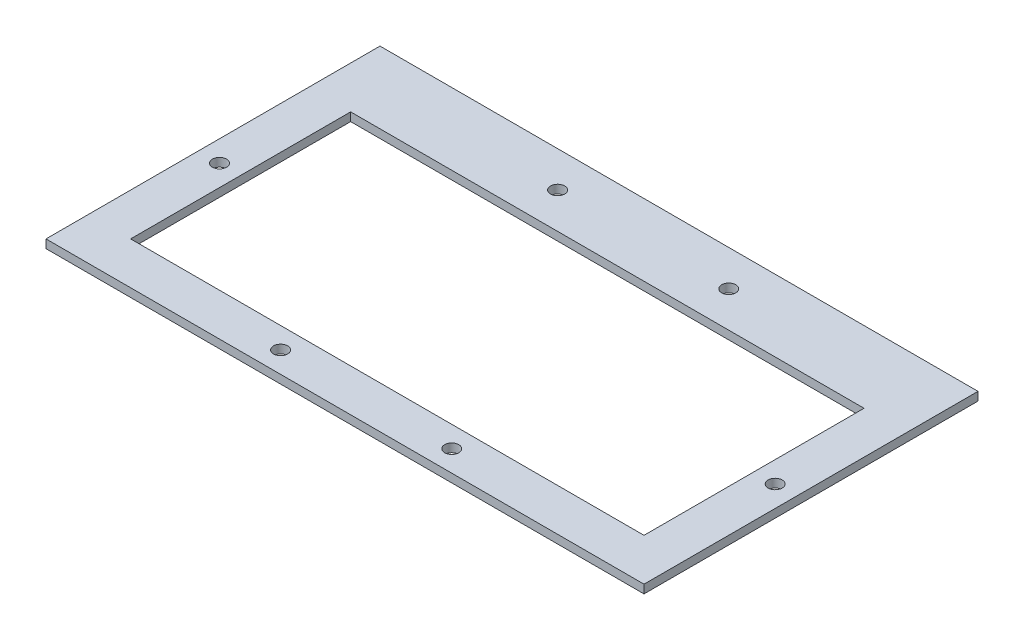
ISO-10303-21;
HEADER;
FILE_DESCRIPTION(('STEP AP214'),'2;1');
FILE_NAME('part.step','',(''),(''),'','','');
FILE_SCHEMA(('AUTOMOTIVE_DESIGN { 1 0 10303 214 1 1 1 1 }'));
ENDSEC;
DATA;
#1=APPLICATION_CONTEXT('core data for automotive mechanical design processes');
#2=APPLICATION_PROTOCOL_DEFINITION('international standard','automotive_design',2000,#1);
#3=PRODUCT_CONTEXT('',#1,'mechanical');
#4=PRODUCT('Part','Part','',(#3));
#5=PRODUCT_RELATED_PRODUCT_CATEGORY('part','',(#4));
#6=PRODUCT_DEFINITION_FORMATION('','',#4);
#7=PRODUCT_DEFINITION_CONTEXT('part definition',#1,'design');
#8=PRODUCT_DEFINITION('design','',#6,#7);
#9=PRODUCT_DEFINITION_SHAPE('','',#8);
#10=(LENGTH_UNIT() NAMED_UNIT(*) SI_UNIT(.MILLI.,.METRE.));
#11=(NAMED_UNIT(*) PLANE_ANGLE_UNIT() SI_UNIT($,.RADIAN.));
#12=(NAMED_UNIT(*) SI_UNIT($,.STERADIAN.) SOLID_ANGLE_UNIT());
#13=UNCERTAINTY_MEASURE_WITH_UNIT(LENGTH_MEASURE(1.E-05),#10,'distance_accuracy_value','');
#14=(GEOMETRIC_REPRESENTATION_CONTEXT(3) GLOBAL_UNCERTAINTY_ASSIGNED_CONTEXT((#13)) GLOBAL_UNIT_ASSIGNED_CONTEXT((#10,
#11,#12)) REPRESENTATION_CONTEXT('',''));
#15=CARTESIAN_POINT('',(0.,0.,0.));
#16=DIRECTION('',(0.,0.,1.));
#17=DIRECTION('',(1.,0.,0.));
#18=AXIS2_PLACEMENT_3D('',#15,#16,#17);
#19=CARTESIAN_POINT('',(0.,3.,0.));
#20=DIRECTION('',(-1.,0.,0.));
#21=DIRECTION('',(0.,0.,1.));
#22=AXIS2_PLACEMENT_3D('',#19,#20,#21);
#23=PLANE('',#22);
#24=DIRECTION('',(0.,0.,-1.));
#25=VECTOR('',#24,1.);
#26=CARTESIAN_POINT('',(0.,0.,0.));
#27=LINE('',#26,#25);
#28=CARTESIAN_POINT('',(0.,0.,93.));
#29=VERTEX_POINT('',#28);
#30=CARTESIAN_POINT('',(0.,0.,-25.4));
#31=VERTEX_POINT('',#30);
#32=EDGE_CURVE('E164',#29,#31,#27,.T.);
#33=ORIENTED_EDGE('',*,*,#32,.F.);
#34=DIRECTION('',(0.,-1.,0.));
#35=VECTOR('',#34,1.);
#36=CARTESIAN_POINT('',(0.,3.,93.));
#37=LINE('',#36,#35);
#38=CARTESIAN_POINT('',(0.,3.,93.));
#39=VERTEX_POINT('',#38);
#40=EDGE_CURVE('E11',#39,#29,#37,.T.);
#41=ORIENTED_EDGE('',*,*,#40,.F.);
#42=DIRECTION('',(0.,0.,-1.));
#43=VECTOR('',#42,1.);
#44=CARTESIAN_POINT('',(0.,3.,0.));
#45=LINE('',#44,#43);
#46=CARTESIAN_POINT('',(0.,3.,-25.4));
#47=VERTEX_POINT('',#46);
#48=EDGE_CURVE('E126',#39,#47,#45,.T.);
#49=ORIENTED_EDGE('',*,*,#48,.T.);
#50=DIRECTION('',(0.,-1.,0.));
#51=VECTOR('',#50,1.);
#52=CARTESIAN_POINT('',(0.,3.,-25.4));
#53=LINE('',#52,#51);
#54=EDGE_CURVE('E54',#47,#31,#53,.T.);
#55=ORIENTED_EDGE('',*,*,#54,.T.);
#56=EDGE_LOOP('',(#33,#41,#49,#55));
#57=FACE_BOUND('',#56,.T.);
#58=ADVANCED_FACE('F35',(#57),#23,.T.);
#59=CARTESIAN_POINT('',(0.,3.,93.));
#60=DIRECTION('',(0.,0.,1.));
#61=DIRECTION('',(1.,0.,0.));
#62=AXIS2_PLACEMENT_3D('',#59,#60,#61);
#63=PLANE('',#62);
#64=DIRECTION('',(-1.,0.,0.));
#65=VECTOR('',#64,1.);
#66=CARTESIAN_POINT('',(0.,0.,93.));
#67=LINE('',#66,#65);
#68=CARTESIAN_POINT('',(212.,0.,93.));
#69=VERTEX_POINT('',#68);
#70=EDGE_CURVE('E113',#69,#29,#67,.T.);
#71=ORIENTED_EDGE('',*,*,#70,.F.);
#72=DIRECTION('',(0.,-1.,0.));
#73=VECTOR('',#72,1.);
#74=CARTESIAN_POINT('',(212.,3.,93.));
#75=LINE('',#74,#73);
#76=CARTESIAN_POINT('',(212.,3.,93.));
#77=VERTEX_POINT('',#76);
#78=EDGE_CURVE('E45',#77,#69,#75,.T.);
#79=ORIENTED_EDGE('',*,*,#78,.F.);
#80=DIRECTION('',(-1.,0.,0.));
#81=VECTOR('',#80,1.);
#82=CARTESIAN_POINT('',(0.,3.,93.));
#83=LINE('',#82,#81);
#84=EDGE_CURVE('E111',#77,#39,#83,.T.);
#85=ORIENTED_EDGE('',*,*,#84,.T.);
#86=ORIENTED_EDGE('',*,*,#40,.T.);
#87=EDGE_LOOP('',(#71,#79,#85,#86));
#88=FACE_BOUND('',#87,.T.);
#89=ADVANCED_FACE('F109',(#88),#63,.T.);
#90=CARTESIAN_POINT('',(212.,3.,0.));
#91=DIRECTION('',(-1.,0.,0.));
#92=DIRECTION('',(0.,0.,1.));
#93=AXIS2_PLACEMENT_3D('',#90,#91,#92);
#94=PLANE('',#93);
#95=DIRECTION('',(0.,0.,-1.));
#96=VECTOR('',#95,1.);
#97=CARTESIAN_POINT('',(212.,0.,0.));
#98=LINE('',#97,#96);
#99=CARTESIAN_POINT('',(212.,0.,-25.4));
#100=VERTEX_POINT('',#99);
#101=EDGE_CURVE('E167',#69,#100,#98,.T.);
#102=ORIENTED_EDGE('',*,*,#101,.T.);
#103=DIRECTION('',(0.,-1.,0.));
#104=VECTOR('',#103,1.);
#105=CARTESIAN_POINT('',(212.,3.,-25.4));
#106=LINE('',#105,#104);
#107=CARTESIAN_POINT('',(212.,3.,-25.4));
#108=VERTEX_POINT('',#107);
#109=EDGE_CURVE('E80',#108,#100,#106,.T.);
#110=ORIENTED_EDGE('',*,*,#109,.F.);
#111=DIRECTION('',(0.,0.,-1.));
#112=VECTOR('',#111,1.);
#113=CARTESIAN_POINT('',(212.,3.,0.));
#114=LINE('',#113,#112);
#115=EDGE_CURVE('E117',#77,#108,#114,.T.);
#116=ORIENTED_EDGE('',*,*,#115,.F.);
#117=ORIENTED_EDGE('',*,*,#78,.T.);
#118=EDGE_LOOP('',(#102,#110,#116,#117));
#119=FACE_BOUND('',#118,.T.);
#120=ADVANCED_FACE('F118',(#119),#94,.F.);
#121=CARTESIAN_POINT('',(15.,3.,0.));
#122=DIRECTION('',(1.,0.,0.));
#123=DIRECTION('',(0.,0.,-1.));
#124=AXIS2_PLACEMENT_3D('',#121,#122,#123);
#125=PLANE('',#124);
#126=DIRECTION('',(0.,0.,1.));
#127=VECTOR('',#126,1.);
#128=CARTESIAN_POINT('',(15.,0.,0.));
#129=LINE('',#128,#127);
#130=CARTESIAN_POINT('',(15.,0.,0.));
#131=VERTEX_POINT('',#130);
#132=CARTESIAN_POINT('',(15.,0.,78.));
#133=VERTEX_POINT('',#132);
#134=EDGE_CURVE('E149',#131,#133,#129,.T.);
#135=ORIENTED_EDGE('',*,*,#134,.F.);
#136=DIRECTION('',(0.,-1.,0.));
#137=VECTOR('',#136,1.);
#138=CARTESIAN_POINT('',(15.,3.,0.));
#139=LINE('',#138,#137);
#140=CARTESIAN_POINT('',(15.,3.,0.));
#141=VERTEX_POINT('',#140);
#142=EDGE_CURVE('E39',#141,#131,#139,.T.);
#143=ORIENTED_EDGE('',*,*,#142,.F.);
#144=DIRECTION('',(0.,0.,1.));
#145=VECTOR('',#144,1.);
#146=CARTESIAN_POINT('',(15.,3.,0.));
#147=LINE('',#146,#145);
#148=CARTESIAN_POINT('',(15.,3.,78.));
#149=VERTEX_POINT('',#148);
#150=EDGE_CURVE('E187',#141,#149,#147,.T.);
#151=ORIENTED_EDGE('',*,*,#150,.T.);
#152=DIRECTION('',(0.,-1.,0.));
#153=VECTOR('',#152,1.);
#154=CARTESIAN_POINT('',(15.,3.,78.));
#155=LINE('',#154,#153);
#156=EDGE_CURVE('E148',#149,#133,#155,.T.);
#157=ORIENTED_EDGE('',*,*,#156,.T.);
#158=EDGE_LOOP('',(#135,#143,#151,#157));
#159=FACE_BOUND('',#158,.T.);
#160=ADVANCED_FACE('F37',(#159),#125,.T.);
#161=CARTESIAN_POINT('',(0.,3.,0.));
#162=DIRECTION('',(0.,0.,-1.));
#163=DIRECTION('',(-1.,0.,0.));
#164=AXIS2_PLACEMENT_3D('',#161,#162,#163);
#165=PLANE('',#164);
#166=DIRECTION('',(1.,0.,0.));
#167=VECTOR('',#166,1.);
#168=CARTESIAN_POINT('',(0.,0.,0.));
#169=LINE('',#168,#167);
#170=CARTESIAN_POINT('',(197.,0.,0.));
#171=VERTEX_POINT('',#170);
#172=EDGE_CURVE('E152',#131,#171,#169,.T.);
#173=ORIENTED_EDGE('',*,*,#172,.T.);
#174=DIRECTION('',(0.,-1.,0.));
#175=VECTOR('',#174,1.);
#176=CARTESIAN_POINT('',(197.,3.,0.));
#177=LINE('',#176,#175);
#178=CARTESIAN_POINT('',(197.,3.,0.));
#179=VERTEX_POINT('',#178);
#180=EDGE_CURVE('E192',#179,#171,#177,.T.);
#181=ORIENTED_EDGE('',*,*,#180,.F.);
#182=DIRECTION('',(1.,0.,0.));
#183=VECTOR('',#182,1.);
#184=CARTESIAN_POINT('',(0.,3.,0.));
#185=LINE('',#184,#183);
#186=EDGE_CURVE('E200',#141,#179,#185,.T.);
#187=ORIENTED_EDGE('',*,*,#186,.F.);
#188=ORIENTED_EDGE('',*,*,#142,.T.);
#189=EDGE_LOOP('',(#173,#181,#187,#188));
#190=FACE_BOUND('',#189,.T.);
#191=ADVANCED_FACE('F199',(#190),#165,.F.);
#192=CARTESIAN_POINT('',(197.,3.,0.));
#193=DIRECTION('',(-1.,0.,0.));
#194=DIRECTION('',(0.,0.,1.));
#195=AXIS2_PLACEMENT_3D('',#192,#193,#194);
#196=PLANE('',#195);
#197=DIRECTION('',(0.,0.,-1.));
#198=VECTOR('',#197,1.);
#199=CARTESIAN_POINT('',(197.,0.,0.));
#200=LINE('',#199,#198);
#201=CARTESIAN_POINT('',(197.,0.,78.));
#202=VERTEX_POINT('',#201);
#203=EDGE_CURVE('E155',#202,#171,#200,.T.);
#204=ORIENTED_EDGE('',*,*,#203,.F.);
#205=DIRECTION('',(0.,-1.,0.));
#206=VECTOR('',#205,1.);
#207=CARTESIAN_POINT('',(197.,3.,78.));
#208=LINE('',#207,#206);
#209=CARTESIAN_POINT('',(197.,3.,78.));
#210=VERTEX_POINT('',#209);
#211=EDGE_CURVE('E191',#210,#202,#208,.T.);
#212=ORIENTED_EDGE('',*,*,#211,.F.);
#213=DIRECTION('',(0.,0.,-1.));
#214=VECTOR('',#213,1.);
#215=CARTESIAN_POINT('',(197.,3.,0.));
#216=LINE('',#215,#214);
#217=EDGE_CURVE('E405',#210,#179,#216,.T.);
#218=ORIENTED_EDGE('',*,*,#217,.T.);
#219=ORIENTED_EDGE('',*,*,#180,.T.);
#220=EDGE_LOOP('',(#204,#212,#218,#219));
#221=FACE_BOUND('',#220,.T.);
#222=ADVANCED_FACE('F212',(#221),#196,.T.);
#223=CARTESIAN_POINT('',(204.5,3.,39.));
#224=DIRECTION('',(0.,-1.,0.));
#225=DIRECTION('',(0.,0.,-1.));
#226=AXIS2_PLACEMENT_3D('',#223,#224,#225);
#227=CYLINDRICAL_SURFACE('',#226,2.5);
#228=CARTESIAN_POINT('',(204.5,3.,39.));
#229=DIRECTION('',(0.,1.,0.));
#230=DIRECTION('',(0.,0.,1.));
#231=AXIS2_PLACEMENT_3D('',#228,#229,#230);
#232=CIRCLE('',#231,2.5);
#233=CARTESIAN_POINT('',(204.5,3.,41.5));
#234=VERTEX_POINT('',#233);
#235=EDGE_CURVE('E142',#234,#234,#232,.T.);
#236=ORIENTED_EDGE('',*,*,#235,.T.);
#237=EDGE_LOOP('',(#236));
#238=FACE_BOUND('',#237,.T.);
#239=CARTESIAN_POINT('',(204.5,0.,39.));
#240=DIRECTION('',(0.,1.,0.));
#241=DIRECTION('',(0.,0.,1.));
#242=AXIS2_PLACEMENT_3D('',#239,#240,#241);
#243=CIRCLE('',#242,2.5);
#244=CARTESIAN_POINT('',(204.5,0.,41.5));
#245=VERTEX_POINT('',#244);
#246=EDGE_CURVE('E181',#245,#245,#243,.T.);
#247=ORIENTED_EDGE('',*,*,#246,.F.);
#248=EDGE_LOOP('',(#247));
#249=FACE_BOUND('',#248,.T.);
#250=ADVANCED_FACE('F214',(#238,#249),#227,.F.);
#251=CARTESIAN_POINT('',(75.6666666666667,3.,85.5));
#252=DIRECTION('',(0.,-1.,0.));
#253=DIRECTION('',(0.,0.,-1.));
#254=AXIS2_PLACEMENT_3D('',#251,#252,#253);
#255=CYLINDRICAL_SURFACE('',#254,2.50000000000001);
#256=CARTESIAN_POINT('',(75.6666666666667,3.,85.5));
#257=DIRECTION('',(0.,1.,0.));
#258=DIRECTION('',(0.,0.,1.));
#259=AXIS2_PLACEMENT_3D('',#256,#257,#258);
#260=CIRCLE('',#259,2.50000000000001);
#261=CARTESIAN_POINT('',(75.6666666666667,3.,88.));
#262=VERTEX_POINT('',#261);
#263=EDGE_CURVE('E139',#262,#262,#260,.T.);
#264=ORIENTED_EDGE('',*,*,#263,.T.);
#265=EDGE_LOOP('',(#264));
#266=FACE_BOUND('',#265,.T.);
#267=CARTESIAN_POINT('',(75.6666666666667,0.,85.5));
#268=DIRECTION('',(0.,1.,0.));
#269=DIRECTION('',(0.,0.,1.));
#270=AXIS2_PLACEMENT_3D('',#267,#268,#269);
#271=CIRCLE('',#270,2.50000000000001);
#272=CARTESIAN_POINT('',(75.6666666666667,0.,88.));
#273=VERTEX_POINT('',#272);
#274=EDGE_CURVE('E178',#273,#273,#271,.T.);
#275=ORIENTED_EDGE('',*,*,#274,.F.);
#276=EDGE_LOOP('',(#275));
#277=FACE_BOUND('',#276,.T.);
#278=ADVANCED_FACE('F220',(#266,#277),#255,.F.);
#279=CARTESIAN_POINT('',(136.333333333333,3.,85.5));
#280=DIRECTION('',(0.,-1.,0.));
#281=DIRECTION('',(0.,0.,-1.));
#282=AXIS2_PLACEMENT_3D('',#279,#280,#281);
#283=CYLINDRICAL_SURFACE('',#282,2.5);
#284=CARTESIAN_POINT('',(136.333333333333,3.,85.5));
#285=DIRECTION('',(0.,1.,0.));
#286=DIRECTION('',(0.,0.,1.));
#287=AXIS2_PLACEMENT_3D('',#284,#285,#286);
#288=CIRCLE('',#287,2.5);
#289=CARTESIAN_POINT('',(136.333333333333,3.,88.));
#290=VERTEX_POINT('',#289);
#291=EDGE_CURVE('E136',#290,#290,#288,.T.);
#292=ORIENTED_EDGE('',*,*,#291,.T.);
#293=EDGE_LOOP('',(#292));
#294=FACE_BOUND('',#293,.T.);
#295=CARTESIAN_POINT('',(136.333333333333,0.,85.5));
#296=DIRECTION('',(0.,1.,0.));
#297=DIRECTION('',(0.,0.,1.));
#298=AXIS2_PLACEMENT_3D('',#295,#296,#297);
#299=CIRCLE('',#298,2.5);
#300=CARTESIAN_POINT('',(136.333333333333,0.,88.));
#301=VERTEX_POINT('',#300);
#302=EDGE_CURVE('E175',#301,#301,#299,.T.);
#303=ORIENTED_EDGE('',*,*,#302,.F.);
#304=EDGE_LOOP('',(#303));
#305=FACE_BOUND('',#304,.T.);
#306=ADVANCED_FACE('F253',(#294,#305),#283,.F.);
#307=CARTESIAN_POINT('',(75.6666666666667,3.,-12.7));
#308=DIRECTION('',(0.,-1.,0.));
#309=DIRECTION('',(0.,0.,-1.));
#310=AXIS2_PLACEMENT_3D('',#307,#308,#309);
#311=CYLINDRICAL_SURFACE('',#310,2.50000000000001);
#312=CARTESIAN_POINT('',(75.6666666666667,3.,-12.7));
#313=DIRECTION('',(0.,1.,0.));
#314=DIRECTION('',(0.,0.,1.));
#315=AXIS2_PLACEMENT_3D('',#312,#313,#314);
#316=CIRCLE('',#315,2.50000000000001);
#317=CARTESIAN_POINT('',(75.6666666666667,3.,-10.2));
#318=VERTEX_POINT('',#317);
#319=EDGE_CURVE('E133',#318,#318,#316,.F.);
#320=ORIENTED_EDGE('',*,*,#319,.F.);
#321=EDGE_LOOP('',(#320));
#322=FACE_BOUND('',#321,.T.);
#323=CARTESIAN_POINT('',(75.6666666666667,0.,-12.7));
#324=DIRECTION('',(0.,1.,0.));
#325=DIRECTION('',(0.,0.,1.));
#326=AXIS2_PLACEMENT_3D('',#323,#324,#325);
#327=CIRCLE('',#326,2.50000000000001);
#328=CARTESIAN_POINT('',(75.6666666666667,0.,-10.2));
#329=VERTEX_POINT('',#328);
#330=EDGE_CURVE('E172',#329,#329,#327,.F.);
#331=ORIENTED_EDGE('',*,*,#330,.T.);
#332=EDGE_LOOP('',(#331));
#333=FACE_BOUND('',#332,.T.);
#334=ADVANCED_FACE('F257',(#322,#333),#311,.F.);
#335=CARTESIAN_POINT('',(0.,3.,-25.4));
#336=DIRECTION('',(0.,0.,-1.));
#337=DIRECTION('',(-1.,0.,0.));
#338=AXIS2_PLACEMENT_3D('',#335,#336,#337);
#339=PLANE('',#338);
#340=DIRECTION('',(1.,0.,0.));
#341=VECTOR('',#340,1.);
#342=CARTESIAN_POINT('',(0.,0.,-25.4));
#343=LINE('',#342,#341);
#344=EDGE_CURVE('E169',#31,#100,#343,.T.);
#345=ORIENTED_EDGE('',*,*,#344,.F.);
#346=ORIENTED_EDGE('',*,*,#54,.F.);
#347=DIRECTION('',(1.,0.,0.));
#348=VECTOR('',#347,1.);
#349=CARTESIAN_POINT('',(0.,3.,-25.4));
#350=LINE('',#349,#348);
#351=EDGE_CURVE('E121',#47,#108,#350,.T.);
#352=ORIENTED_EDGE('',*,*,#351,.T.);
#353=ORIENTED_EDGE('',*,*,#109,.T.);
#354=EDGE_LOOP('',(#345,#346,#352,#353));
#355=FACE_BOUND('',#354,.T.);
#356=ADVANCED_FACE('F234',(#355),#339,.T.);
#357=CARTESIAN_POINT('',(136.333333333333,3.,-12.7));
#358=DIRECTION('',(0.,-1.,0.));
#359=DIRECTION('',(0.,0.,-1.));
#360=AXIS2_PLACEMENT_3D('',#357,#358,#359);
#361=CYLINDRICAL_SURFACE('',#360,2.5);
#362=CARTESIAN_POINT('',(136.333333333333,3.,-12.7));
#363=DIRECTION('',(0.,1.,0.));
#364=DIRECTION('',(0.,0.,1.));
#365=AXIS2_PLACEMENT_3D('',#362,#363,#364);
#366=CIRCLE('',#365,2.5);
#367=CARTESIAN_POINT('',(136.333333333333,3.,-10.2));
#368=VERTEX_POINT('',#367);
#369=EDGE_CURVE('E128',#368,#368,#366,.F.);
#370=ORIENTED_EDGE('',*,*,#369,.F.);
#371=EDGE_LOOP('',(#370));
#372=FACE_BOUND('',#371,.T.);
#373=CARTESIAN_POINT('',(136.333333333333,0.,-12.7));
#374=DIRECTION('',(0.,1.,0.));
#375=DIRECTION('',(0.,0.,1.));
#376=AXIS2_PLACEMENT_3D('',#373,#374,#375);
#377=CIRCLE('',#376,2.5);
#378=CARTESIAN_POINT('',(136.333333333333,0.,-10.2));
#379=VERTEX_POINT('',#378);
#380=EDGE_CURVE('E161',#379,#379,#377,.F.);
#381=ORIENTED_EDGE('',*,*,#380,.T.);
#382=EDGE_LOOP('',(#381));
#383=FACE_BOUND('',#382,.T.);
#384=ADVANCED_FACE('F232',(#372,#383),#361,.F.);
#385=CARTESIAN_POINT('',(0.,3.,78.));
#386=DIRECTION('',(0.,0.,-1.));
#387=DIRECTION('',(-1.,0.,0.));
#388=AXIS2_PLACEMENT_3D('',#385,#386,#387);
#389=PLANE('',#388);
#390=DIRECTION('',(1.,0.,0.));
#391=VECTOR('',#390,1.);
#392=CARTESIAN_POINT('',(0.,0.,78.));
#393=LINE('',#392,#391);
#394=EDGE_CURVE('E158',#133,#202,#393,.T.);
#395=ORIENTED_EDGE('',*,*,#394,.F.);
#396=ORIENTED_EDGE('',*,*,#156,.F.);
#397=DIRECTION('',(1.,0.,0.));
#398=VECTOR('',#397,1.);
#399=CARTESIAN_POINT('',(0.,3.,78.));
#400=LINE('',#399,#398);
#401=EDGE_CURVE('E210',#149,#210,#400,.T.);
#402=ORIENTED_EDGE('',*,*,#401,.T.);
#403=ORIENTED_EDGE('',*,*,#211,.T.);
#404=EDGE_LOOP('',(#395,#396,#402,#403));
#405=FACE_BOUND('',#404,.T.);
#406=ADVANCED_FACE('F209',(#405),#389,.T.);
#407=CARTESIAN_POINT('',(7.5,3.,39.));
#408=DIRECTION('',(0.,-1.,0.));
#409=DIRECTION('',(0.,0.,-1.));
#410=AXIS2_PLACEMENT_3D('',#407,#408,#409);
#411=CYLINDRICAL_SURFACE('',#410,2.5);
#412=CARTESIAN_POINT('',(7.5,3.,39.));
#413=DIRECTION('',(0.,1.,0.));
#414=DIRECTION('',(0.,0.,1.));
#415=AXIS2_PLACEMENT_3D('',#412,#413,#414);
#416=CIRCLE('',#415,2.5);
#417=CARTESIAN_POINT('',(7.5,3.,41.5));
#418=VERTEX_POINT('',#417);
#419=EDGE_CURVE('E145',#418,#418,#416,.T.);
#420=ORIENTED_EDGE('',*,*,#419,.T.);
#421=EDGE_LOOP('',(#420));
#422=FACE_BOUND('',#421,.T.);
#423=CARTESIAN_POINT('',(7.5,0.,39.));
#424=DIRECTION('',(0.,1.,0.));
#425=DIRECTION('',(0.,0.,1.));
#426=AXIS2_PLACEMENT_3D('',#423,#424,#425);
#427=CIRCLE('',#426,2.5);
#428=CARTESIAN_POINT('',(7.5,0.,41.5));
#429=VERTEX_POINT('',#428);
#430=EDGE_CURVE('E184',#429,#429,#427,.T.);
#431=ORIENTED_EDGE('',*,*,#430,.F.);
#432=EDGE_LOOP('',(#431));
#433=FACE_BOUND('',#432,.T.);
#434=ADVANCED_FACE('F237',(#422,#433),#411,.F.);
#435=CARTESIAN_POINT('',(0.,3.,0.));
#436=DIRECTION('',(0.,1.,0.));
#437=DIRECTION('',(0.,0.,1.));
#438=AXIS2_PLACEMENT_3D('',#435,#436,#437);
#439=PLANE('',#438);
#440=ORIENTED_EDGE('',*,*,#150,.F.);
#441=ORIENTED_EDGE('',*,*,#186,.T.);
#442=ORIENTED_EDGE('',*,*,#217,.F.);
#443=ORIENTED_EDGE('',*,*,#401,.F.);
#444=EDGE_LOOP('',(#440,#441,#442,#443));
#445=FACE_BOUND('',#444,.T.);
#446=ORIENTED_EDGE('',*,*,#369,.T.);
#447=EDGE_LOOP('',(#446));
#448=FACE_BOUND('',#447,.T.);
#449=ORIENTED_EDGE('',*,*,#48,.F.);
#450=ORIENTED_EDGE('',*,*,#84,.F.);
#451=ORIENTED_EDGE('',*,*,#115,.T.);
#452=ORIENTED_EDGE('',*,*,#351,.F.);
#453=EDGE_LOOP('',(#449,#450,#451,#452));
#454=FACE_BOUND('',#453,.T.);
#455=ORIENTED_EDGE('',*,*,#319,.T.);
#456=EDGE_LOOP('',(#455));
#457=FACE_BOUND('',#456,.T.);
#458=ORIENTED_EDGE('',*,*,#291,.F.);
#459=EDGE_LOOP('',(#458));
#460=FACE_BOUND('',#459,.T.);
#461=ORIENTED_EDGE('',*,*,#263,.F.);
#462=EDGE_LOOP('',(#461));
#463=FACE_BOUND('',#462,.T.);
#464=ORIENTED_EDGE('',*,*,#235,.F.);
#465=EDGE_LOOP('',(#464));
#466=FACE_BOUND('',#465,.T.);
#467=ORIENTED_EDGE('',*,*,#419,.F.);
#468=EDGE_LOOP('',(#467));
#469=FACE_BOUND('',#468,.T.);
#470=ADVANCED_FACE('F124',(#445,#448,#454,#457,#460,#463,#466,#469),#439,.T.);
#471=CARTESIAN_POINT('',(0.,0.,0.));
#472=DIRECTION('',(0.,1.,0.));
#473=DIRECTION('',(0.,0.,1.));
#474=AXIS2_PLACEMENT_3D('',#471,#472,#473);
#475=PLANE('',#474);
#476=ORIENTED_EDGE('',*,*,#134,.T.);
#477=ORIENTED_EDGE('',*,*,#394,.T.);
#478=ORIENTED_EDGE('',*,*,#203,.T.);
#479=ORIENTED_EDGE('',*,*,#172,.F.);
#480=EDGE_LOOP('',(#476,#477,#478,#479));
#481=FACE_BOUND('',#480,.T.);
#482=ORIENTED_EDGE('',*,*,#380,.F.);
#483=EDGE_LOOP('',(#482));
#484=FACE_BOUND('',#483,.T.);
#485=ORIENTED_EDGE('',*,*,#32,.T.);
#486=ORIENTED_EDGE('',*,*,#344,.T.);
#487=ORIENTED_EDGE('',*,*,#101,.F.);
#488=ORIENTED_EDGE('',*,*,#70,.T.);
#489=EDGE_LOOP('',(#485,#486,#487,#488));
#490=FACE_BOUND('',#489,.T.);
#491=ORIENTED_EDGE('',*,*,#330,.F.);
#492=EDGE_LOOP('',(#491));
#493=FACE_BOUND('',#492,.T.);
#494=ORIENTED_EDGE('',*,*,#302,.T.);
#495=EDGE_LOOP('',(#494));
#496=FACE_BOUND('',#495,.T.);
#497=ORIENTED_EDGE('',*,*,#274,.T.);
#498=EDGE_LOOP('',(#497));
#499=FACE_BOUND('',#498,.T.);
#500=ORIENTED_EDGE('',*,*,#246,.T.);
#501=EDGE_LOOP('',(#500));
#502=FACE_BOUND('',#501,.T.);
#503=ORIENTED_EDGE('',*,*,#430,.T.);
#504=EDGE_LOOP('',(#503));
#505=FACE_BOUND('',#504,.T.);
#506=ADVANCED_FACE('F203',(#481,#484,#490,#493,#496,#499,#502,#505),#475,.F.);
#507=CLOSED_SHELL('',(#58,#89,#120,#160,#191,#222,#250,#278,#306,#334,#356,#384,#406,#434,#470,#506));
#508=MANIFOLD_SOLID_BREP('B2',#507);
#509=ADVANCED_BREP_SHAPE_REPRESENTATION('',(#18,#508),#14);
#510=SHAPE_DEFINITION_REPRESENTATION(#9,#509);
ENDSEC;
END-ISO-10303-21;
